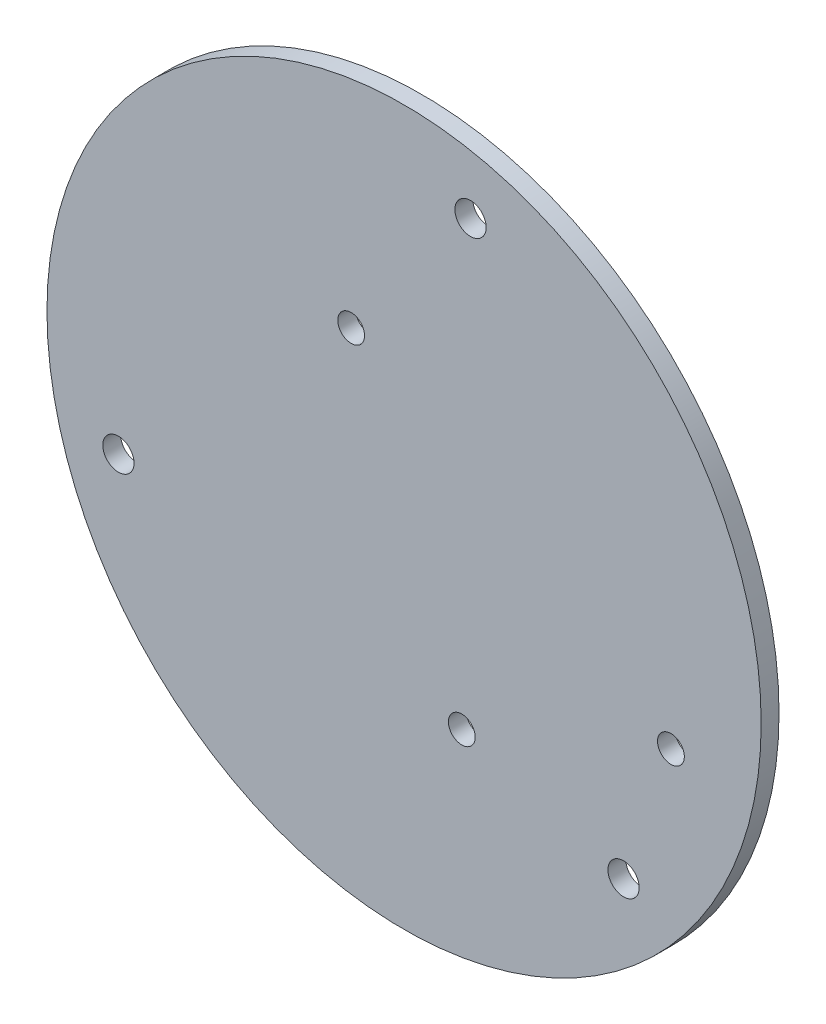
ISO-10303-21;
HEADER;
FILE_DESCRIPTION(('STEP AP214'),'2;1');
FILE_NAME('part.step','',(''),(''),'','','');
FILE_SCHEMA(('AUTOMOTIVE_DESIGN { 1 0 10303 214 1 1 1 1 }'));
ENDSEC;
DATA;
#1=APPLICATION_CONTEXT('core data for automotive mechanical design processes');
#2=APPLICATION_PROTOCOL_DEFINITION('international standard','automotive_design',2000,#1);
#3=PRODUCT_CONTEXT('',#1,'mechanical');
#4=PRODUCT('Part','Part','',(#3));
#5=PRODUCT_RELATED_PRODUCT_CATEGORY('part','',(#4));
#6=PRODUCT_DEFINITION_FORMATION('','',#4);
#7=PRODUCT_DEFINITION_CONTEXT('part definition',#1,'design');
#8=PRODUCT_DEFINITION('design','',#6,#7);
#9=PRODUCT_DEFINITION_SHAPE('','',#8);
#10=(LENGTH_UNIT() NAMED_UNIT(*) SI_UNIT(.MILLI.,.METRE.));
#11=(NAMED_UNIT(*) PLANE_ANGLE_UNIT() SI_UNIT($,.RADIAN.));
#12=(NAMED_UNIT(*) SI_UNIT($,.STERADIAN.) SOLID_ANGLE_UNIT());
#13=UNCERTAINTY_MEASURE_WITH_UNIT(LENGTH_MEASURE(1.E-05),#10,'distance_accuracy_value','');
#14=(GEOMETRIC_REPRESENTATION_CONTEXT(3) GLOBAL_UNCERTAINTY_ASSIGNED_CONTEXT((#13)) GLOBAL_UNIT_ASSIGNED_CONTEXT((#10,
#11,#12)) REPRESENTATION_CONTEXT('',''));
#15=CARTESIAN_POINT('',(0.,0.,0.));
#16=DIRECTION('',(0.,0.,1.));
#17=DIRECTION('',(1.,0.,0.));
#18=AXIS2_PLACEMENT_3D('',#15,#16,#17);
#19=CARTESIAN_POINT('',(0.,0.,2.));
#20=DIRECTION('',(0.,0.,1.));
#21=DIRECTION('',(1.,0.,0.));
#22=AXIS2_PLACEMENT_3D('',#19,#20,#21);
#23=PLANE('',#22);
#24=CARTESIAN_POINT('',(29.8902619623998,-7.54009097535293,2.));
#25=DIRECTION('',(0.,0.,1.));
#26=DIRECTION('',(1.,0.,0.));
#27=AXIS2_PLACEMENT_3D('',#24,#25,#26);
#28=CIRCLE('',#27,1.50000000000001);
#29=CARTESIAN_POINT('',(31.3902619623998,-7.54009097535293,2.));
#30=VERTEX_POINT('',#29);
#31=EDGE_CURVE('E80',#30,#30,#28,.T.);
#32=ORIENTED_EDGE('',*,*,#31,.F.);
#33=EDGE_LOOP('',(#32));
#34=FACE_BOUND('',#33,.T.);
#35=CARTESIAN_POINT('',(7.44429223434131,32.6948040625086,2.));
#36=DIRECTION('',(0.,0.,1.));
#37=DIRECTION('',(1.,0.,0.));
#38=AXIS2_PLACEMENT_3D('',#35,#36,#37);
#39=CIRCLE('',#38,1.75);
#40=CARTESIAN_POINT('',(9.19429223434131,32.6948040625086,2.));
#41=VERTEX_POINT('',#40);
#42=EDGE_CURVE('E64',#41,#41,#39,.T.);
#43=ORIENTED_EDGE('',*,*,#42,.F.);
#44=EDGE_LOOP('',(#43));
#45=FACE_BOUND('',#44,.T.);
#46=CARTESIAN_POINT('',(-31.9954824005529,-9.88772526614394,2.));
#47=DIRECTION('',(0.,0.,1.));
#48=DIRECTION('',(1.,0.,0.));
#49=AXIS2_PLACEMENT_3D('',#46,#47,#48);
#50=CIRCLE('',#49,1.75);
#51=CARTESIAN_POINT('',(-30.2454824005529,-9.88772526614394,2.));
#52=VERTEX_POINT('',#51);
#53=EDGE_CURVE('E50',#52,#52,#50,.T.);
#54=ORIENTED_EDGE('',*,*,#53,.F.);
#55=EDGE_LOOP('',(#54));
#56=FACE_BOUND('',#55,.T.);
#57=CARTESIAN_POINT('',(0.,0.,2.));
#58=DIRECTION('',(0.,0.,1.));
#59=DIRECTION('',(1.,0.,0.));
#60=AXIS2_PLACEMENT_3D('',#57,#58,#59);
#61=CIRCLE('',#60,40.);
#62=CARTESIAN_POINT('',(40.,0.,2.));
#63=VERTEX_POINT('',#62);
#64=EDGE_CURVE('E10',#63,#63,#61,.T.);
#65=ORIENTED_EDGE('',*,*,#64,.T.);
#66=EDGE_LOOP('',(#65));
#67=FACE_BOUND('',#66,.T.);
#68=CARTESIAN_POINT('',(24.5821602238039,-22.7848712235444,2.));
#69=DIRECTION('',(0.,0.,1.));
#70=DIRECTION('',(1.,0.,0.));
#71=AXIS2_PLACEMENT_3D('',#68,#69,#70);
#72=CIRCLE('',#71,1.75);
#73=CARTESIAN_POINT('',(26.3321602238039,-22.7848712235444,2.));
#74=VERTEX_POINT('',#73);
#75=EDGE_CURVE('E56',#74,#74,#72,.T.);
#76=ORIENTED_EDGE('',*,*,#75,.F.);
#77=EDGE_LOOP('',(#76));
#78=FACE_BOUND('',#77,.T.);
#79=CARTESIAN_POINT('',(-5.92473933774102,15.3899260737229,2.));
#80=DIRECTION('',(0.,0.,1.));
#81=DIRECTION('',(1.,0.,0.));
#82=AXIS2_PLACEMENT_3D('',#79,#80,#81);
#83=CIRCLE('',#82,1.5);
#84=CARTESIAN_POINT('',(-4.42473933774102,15.3899260737229,2.));
#85=VERTEX_POINT('',#84);
#86=EDGE_CURVE('E72',#85,#85,#83,.T.);
#87=ORIENTED_EDGE('',*,*,#86,.F.);
#88=EDGE_LOOP('',(#87));
#89=FACE_BOUND('',#88,.T.);
#90=CARTESIAN_POINT('',(6.46587512099064,-17.361908582294,2.));
#91=DIRECTION('',(0.,0.,1.));
#92=DIRECTION('',(1.,0.,0.));
#93=AXIS2_PLACEMENT_3D('',#90,#91,#92);
#94=CIRCLE('',#93,1.5);
#95=CARTESIAN_POINT('',(7.96587512099064,-17.361908582294,2.));
#96=VERTEX_POINT('',#95);
#97=EDGE_CURVE('E88',#96,#96,#94,.T.);
#98=ORIENTED_EDGE('',*,*,#97,.F.);
#99=EDGE_LOOP('',(#98));
#100=FACE_BOUND('',#99,.T.);
#101=ADVANCED_FACE('F37',(#34,#45,#56,#67,#78,#89,#100),#23,.T.);
#102=CARTESIAN_POINT('',(0.,0.,0.));
#103=DIRECTION('',(0.,0.,1.));
#104=DIRECTION('',(1.,0.,0.));
#105=AXIS2_PLACEMENT_3D('',#102,#103,#104);
#106=PLANE('',#105);
#107=CARTESIAN_POINT('',(0.,0.,0.));
#108=DIRECTION('',(0.,0.,1.));
#109=DIRECTION('',(1.,0.,0.));
#110=AXIS2_PLACEMENT_3D('',#107,#108,#109);
#111=CIRCLE('',#110,40.);
#112=CARTESIAN_POINT('',(40.,0.,0.));
#113=VERTEX_POINT('',#112);
#114=EDGE_CURVE('E41',#113,#113,#111,.T.);
#115=ORIENTED_EDGE('',*,*,#114,.F.);
#116=EDGE_LOOP('',(#115));
#117=FACE_BOUND('',#116,.T.);
#118=CARTESIAN_POINT('',(-31.9954824005529,-9.88772526614394,0.));
#119=DIRECTION('',(0.,0.,1.));
#120=DIRECTION('',(1.,0.,0.));
#121=AXIS2_PLACEMENT_3D('',#118,#119,#120);
#122=CIRCLE('',#121,1.75);
#123=CARTESIAN_POINT('',(-30.2454824005529,-9.88772526614394,0.));
#124=VERTEX_POINT('',#123);
#125=EDGE_CURVE('E52',#124,#124,#122,.T.);
#126=ORIENTED_EDGE('',*,*,#125,.T.);
#127=EDGE_LOOP('',(#126));
#128=FACE_BOUND('',#127,.T.);
#129=CARTESIAN_POINT('',(24.5821602238039,-22.7848712235444,0.));
#130=DIRECTION('',(0.,0.,1.));
#131=DIRECTION('',(1.,0.,0.));
#132=AXIS2_PLACEMENT_3D('',#129,#130,#131);
#133=CIRCLE('',#132,1.75);
#134=CARTESIAN_POINT('',(26.3321602238039,-22.7848712235444,0.));
#135=VERTEX_POINT('',#134);
#136=EDGE_CURVE('E60',#135,#135,#133,.T.);
#137=ORIENTED_EDGE('',*,*,#136,.T.);
#138=EDGE_LOOP('',(#137));
#139=FACE_BOUND('',#138,.T.);
#140=CARTESIAN_POINT('',(7.44429223434131,32.6948040625086,0.));
#141=DIRECTION('',(0.,0.,1.));
#142=DIRECTION('',(1.,0.,0.));
#143=AXIS2_PLACEMENT_3D('',#140,#141,#142);
#144=CIRCLE('',#143,1.75);
#145=CARTESIAN_POINT('',(9.19429223434131,32.6948040625086,0.));
#146=VERTEX_POINT('',#145);
#147=EDGE_CURVE('E68',#146,#146,#144,.T.);
#148=ORIENTED_EDGE('',*,*,#147,.T.);
#149=EDGE_LOOP('',(#148));
#150=FACE_BOUND('',#149,.T.);
#151=CARTESIAN_POINT('',(-5.92473933774102,15.3899260737229,0.));
#152=DIRECTION('',(0.,0.,1.));
#153=DIRECTION('',(1.,0.,0.));
#154=AXIS2_PLACEMENT_3D('',#151,#152,#153);
#155=CIRCLE('',#154,1.5);
#156=CARTESIAN_POINT('',(-4.42473933774102,15.3899260737229,0.));
#157=VERTEX_POINT('',#156);
#158=EDGE_CURVE('E76',#157,#157,#155,.T.);
#159=ORIENTED_EDGE('',*,*,#158,.T.);
#160=EDGE_LOOP('',(#159));
#161=FACE_BOUND('',#160,.T.);
#162=CARTESIAN_POINT('',(29.8902619623998,-7.54009097535293,0.));
#163=DIRECTION('',(0.,0.,1.));
#164=DIRECTION('',(1.,0.,0.));
#165=AXIS2_PLACEMENT_3D('',#162,#163,#164);
#166=CIRCLE('',#165,1.50000000000001);
#167=CARTESIAN_POINT('',(31.3902619623998,-7.54009097535293,0.));
#168=VERTEX_POINT('',#167);
#169=EDGE_CURVE('E84',#168,#168,#166,.T.);
#170=ORIENTED_EDGE('',*,*,#169,.T.);
#171=EDGE_LOOP('',(#170));
#172=FACE_BOUND('',#171,.T.);
#173=CARTESIAN_POINT('',(6.46587512099064,-17.361908582294,0.));
#174=DIRECTION('',(0.,0.,1.));
#175=DIRECTION('',(1.,0.,0.));
#176=AXIS2_PLACEMENT_3D('',#173,#174,#175);
#177=CIRCLE('',#176,1.5);
#178=CARTESIAN_POINT('',(7.96587512099064,-17.361908582294,0.));
#179=VERTEX_POINT('',#178);
#180=EDGE_CURVE('E92',#179,#179,#177,.T.);
#181=ORIENTED_EDGE('',*,*,#180,.T.);
#182=EDGE_LOOP('',(#181));
#183=FACE_BOUND('',#182,.T.);
#184=ADVANCED_FACE('F104',(#117,#128,#139,#150,#161,#172,#183),#106,.F.);
#185=CARTESIAN_POINT('',(0.,0.,2.));
#186=DIRECTION('',(0.,0.,-1.));
#187=DIRECTION('',(-1.,0.,0.));
#188=AXIS2_PLACEMENT_3D('',#185,#186,#187);
#189=CYLINDRICAL_SURFACE('',#188,40.);
#190=ORIENTED_EDGE('',*,*,#64,.F.);
#191=EDGE_LOOP('',(#190));
#192=FACE_BOUND('',#191,.T.);
#193=ORIENTED_EDGE('',*,*,#114,.T.);
#194=EDGE_LOOP('',(#193));
#195=FACE_BOUND('',#194,.T.);
#196=ADVANCED_FACE('F39',(#192,#195),#189,.T.);
#197=CARTESIAN_POINT('',(-31.9954824005529,-9.88772526614394,2.));
#198=DIRECTION('',(0.,0.,-1.));
#199=DIRECTION('',(-1.,0.,0.));
#200=AXIS2_PLACEMENT_3D('',#197,#198,#199);
#201=CYLINDRICAL_SURFACE('',#200,1.75);
#202=ORIENTED_EDGE('',*,*,#53,.T.);
#203=EDGE_LOOP('',(#202));
#204=FACE_BOUND('',#203,.T.);
#205=ORIENTED_EDGE('',*,*,#125,.F.);
#206=EDGE_LOOP('',(#205));
#207=FACE_BOUND('',#206,.T.);
#208=ADVANCED_FACE('F114',(#204,#207),#201,.F.);
#209=CARTESIAN_POINT('',(24.5821602238039,-22.7848712235444,2.));
#210=DIRECTION('',(0.,0.,-1.));
#211=DIRECTION('',(-1.,0.,0.));
#212=AXIS2_PLACEMENT_3D('',#209,#210,#211);
#213=CYLINDRICAL_SURFACE('',#212,1.75);
#214=ORIENTED_EDGE('',*,*,#75,.T.);
#215=EDGE_LOOP('',(#214));
#216=FACE_BOUND('',#215,.T.);
#217=ORIENTED_EDGE('',*,*,#136,.F.);
#218=EDGE_LOOP('',(#217));
#219=FACE_BOUND('',#218,.T.);
#220=ADVANCED_FACE('F117',(#216,#219),#213,.F.);
#221=CARTESIAN_POINT('',(7.44429223434131,32.6948040625086,2.));
#222=DIRECTION('',(0.,0.,-1.));
#223=DIRECTION('',(-1.,0.,0.));
#224=AXIS2_PLACEMENT_3D('',#221,#222,#223);
#225=CYLINDRICAL_SURFACE('',#224,1.75);
#226=ORIENTED_EDGE('',*,*,#42,.T.);
#227=EDGE_LOOP('',(#226));
#228=FACE_BOUND('',#227,.T.);
#229=ORIENTED_EDGE('',*,*,#147,.F.);
#230=EDGE_LOOP('',(#229));
#231=FACE_BOUND('',#230,.T.);
#232=ADVANCED_FACE('F121',(#228,#231),#225,.F.);
#233=CARTESIAN_POINT('',(-5.92473933774102,15.3899260737229,2.));
#234=DIRECTION('',(0.,0.,-1.));
#235=DIRECTION('',(-1.,0.,0.));
#236=AXIS2_PLACEMENT_3D('',#233,#234,#235);
#237=CYLINDRICAL_SURFACE('',#236,1.5);
#238=ORIENTED_EDGE('',*,*,#86,.T.);
#239=EDGE_LOOP('',(#238));
#240=FACE_BOUND('',#239,.T.);
#241=ORIENTED_EDGE('',*,*,#158,.F.);
#242=EDGE_LOOP('',(#241));
#243=FACE_BOUND('',#242,.T.);
#244=ADVANCED_FACE('F125',(#240,#243),#237,.F.);
#245=CARTESIAN_POINT('',(29.8902619623998,-7.54009097535293,2.));
#246=DIRECTION('',(0.,0.,-1.));
#247=DIRECTION('',(-1.,0.,0.));
#248=AXIS2_PLACEMENT_3D('',#245,#246,#247);
#249=CYLINDRICAL_SURFACE('',#248,1.50000000000001);
#250=ORIENTED_EDGE('',*,*,#31,.T.);
#251=EDGE_LOOP('',(#250));
#252=FACE_BOUND('',#251,.T.);
#253=ORIENTED_EDGE('',*,*,#169,.F.);
#254=EDGE_LOOP('',(#253));
#255=FACE_BOUND('',#254,.T.);
#256=ADVANCED_FACE('F129',(#252,#255),#249,.F.);
#257=CARTESIAN_POINT('',(6.46587512099064,-17.361908582294,2.));
#258=DIRECTION('',(0.,0.,-1.));
#259=DIRECTION('',(-1.,0.,0.));
#260=AXIS2_PLACEMENT_3D('',#257,#258,#259);
#261=CYLINDRICAL_SURFACE('',#260,1.5);
#262=ORIENTED_EDGE('',*,*,#97,.T.);
#263=EDGE_LOOP('',(#262));
#264=FACE_BOUND('',#263,.T.);
#265=ORIENTED_EDGE('',*,*,#180,.F.);
#266=EDGE_LOOP('',(#265));
#267=FACE_BOUND('',#266,.T.);
#268=ADVANCED_FACE('F100',(#264,#267),#261,.F.);
#269=CLOSED_SHELL('',(#101,#184,#196,#208,#220,#232,#244,#256,#268));
#270=MANIFOLD_SOLID_BREP('B2',#269);
#271=ADVANCED_BREP_SHAPE_REPRESENTATION('',(#18,#270),#14);
#272=SHAPE_DEFINITION_REPRESENTATION(#9,#271);
ENDSEC;
END-ISO-10303-21;
